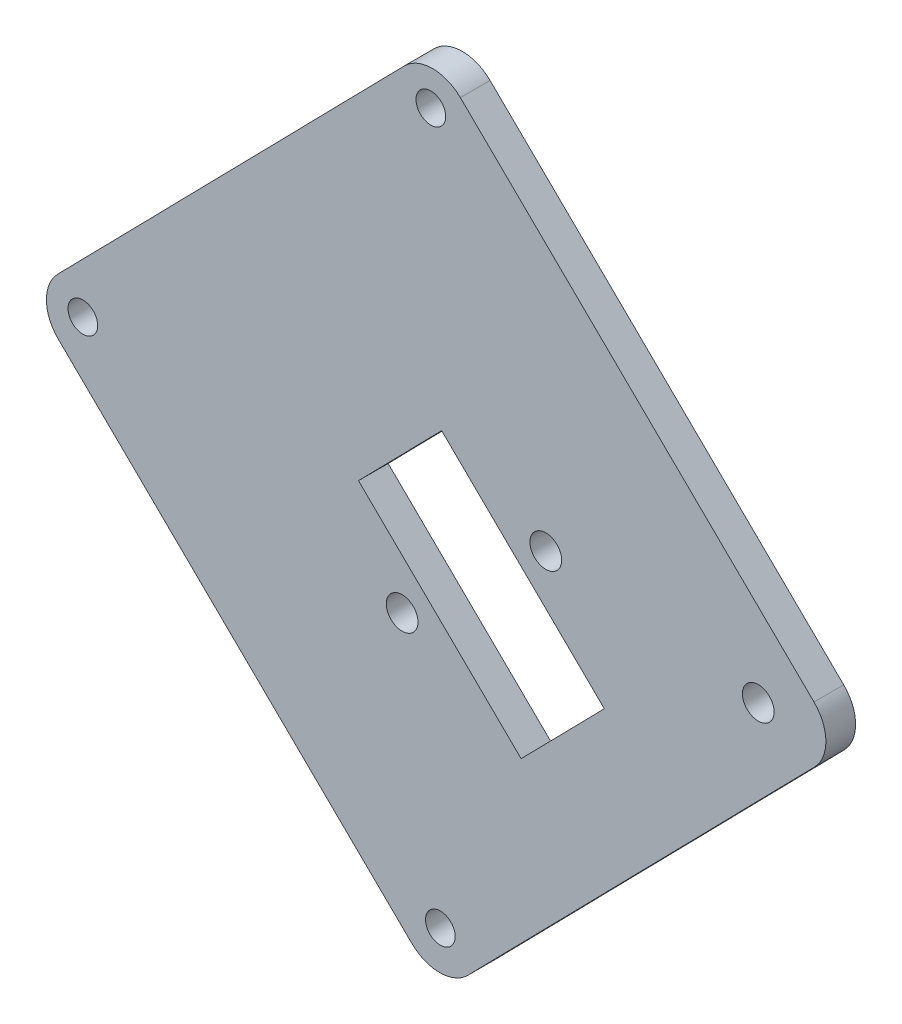
ISO-10303-21;
HEADER;
FILE_DESCRIPTION(('STEP AP214'),'2;1');
FILE_NAME('part.step','',(''),(''),'','','');
FILE_SCHEMA(('AUTOMOTIVE_DESIGN { 1 0 10303 214 1 1 1 1 }'));
ENDSEC;
DATA;
#1=APPLICATION_CONTEXT('core data for automotive mechanical design processes');
#2=APPLICATION_PROTOCOL_DEFINITION('international standard','automotive_design',2000,#1);
#3=PRODUCT_CONTEXT('',#1,'mechanical');
#4=PRODUCT('Part','Part','',(#3));
#5=PRODUCT_RELATED_PRODUCT_CATEGORY('part','',(#4));
#6=PRODUCT_DEFINITION_FORMATION('','',#4);
#7=PRODUCT_DEFINITION_CONTEXT('part definition',#1,'design');
#8=PRODUCT_DEFINITION('design','',#6,#7);
#9=PRODUCT_DEFINITION_SHAPE('','',#8);
#10=(LENGTH_UNIT() NAMED_UNIT(*) SI_UNIT(.MILLI.,.METRE.));
#11=(NAMED_UNIT(*) PLANE_ANGLE_UNIT() SI_UNIT($,.RADIAN.));
#12=(NAMED_UNIT(*) SI_UNIT($,.STERADIAN.) SOLID_ANGLE_UNIT());
#13=UNCERTAINTY_MEASURE_WITH_UNIT(LENGTH_MEASURE(1.E-05),#10,'distance_accuracy_value','');
#14=(GEOMETRIC_REPRESENTATION_CONTEXT(3) GLOBAL_UNCERTAINTY_ASSIGNED_CONTEXT((#13)) GLOBAL_UNIT_ASSIGNED_CONTEXT((#10,
#11,#12)) REPRESENTATION_CONTEXT('',''));
#15=CARTESIAN_POINT('',(0.,0.,0.));
#16=DIRECTION('',(0.,0.,1.));
#17=DIRECTION('',(1.,0.,0.));
#18=AXIS2_PLACEMENT_3D('',#15,#16,#17);
#19=CARTESIAN_POINT('',(35.0687942820861,0.615483898388567,3.));
#20=DIRECTION('',(0.,0.,-1.));
#21=DIRECTION('',(-1.,0.,0.));
#22=AXIS2_PLACEMENT_3D('',#19,#20,#21);
#23=PLANE('',#22);
#24=CARTESIAN_POINT('',(-0.820879587953391,36.0721307997572,3.));
#25=DIRECTION('',(0.,0.,-1.));
#26=DIRECTION('',(-1.,0.,0.));
#27=AXIS2_PLACEMENT_3D('',#24,#25,#26);
#28=CIRCLE('',#27,1.5);
#29=CARTESIAN_POINT('',(-2.32087958795339,36.0721307997572,3.));
#30=VERTEX_POINT('',#29);
#31=EDGE_CURVE('E364',#30,#30,#28,.T.);
#32=ORIENTED_EDGE('',*,*,#31,.T.);
#33=EDGE_LOOP('',(#32));
#34=FACE_BOUND('',#33,.T.);
#35=CARTESIAN_POINT('',(-35.959699189732,0.221003104890149,3.));
#36=DIRECTION('',(0.,0.,-1.));
#37=DIRECTION('',(-1.,0.,0.));
#38=AXIS2_PLACEMENT_3D('',#35,#36,#37);
#39=CIRCLE('',#38,1.5);
#40=CARTESIAN_POINT('',(-37.459699189732,0.221003104890149,3.));
#41=VERTEX_POINT('',#40);
#42=EDGE_CURVE('E367',#41,#41,#39,.T.);
#43=ORIENTED_EDGE('',*,*,#42,.T.);
#44=EDGE_LOOP('',(#43));
#45=FACE_BOUND('',#44,.T.);
#46=CARTESIAN_POINT('',(0.141386566752624,-35.1628082670204,3.));
#47=DIRECTION('',(0.,0.,-1.));
#48=DIRECTION('',(-1.,0.,0.));
#49=AXIS2_PLACEMENT_3D('',#46,#47,#48);
#50=CIRCLE('',#49,1.5);
#51=CARTESIAN_POINT('',(-1.35861343324738,-35.1628082670204,3.));
#52=VERTEX_POINT('',#51);
#53=EDGE_CURVE('E376',#52,#52,#50,.T.);
#54=ORIENTED_EDGE('',*,*,#53,.T.);
#55=EDGE_LOOP('',(#54));
#56=FACE_BOUND('',#55,.T.);
#57=CARTESIAN_POINT('',(35.0687942820861,0.615483898388567,3.));
#58=DIRECTION('',(0.,0.,1.));
#59=DIRECTION('',(-1.,0.,0.));
#60=AXIS2_PLACEMENT_3D('',#57,#58,#59);
#61=CIRCLE('',#60,4.);
#62=CARTESIAN_POINT('',(37.9254578434301,-2.18442204597626,3.));
#63=VERTEX_POINT('',#62);
#64=CARTESIAN_POINT('',(37.868700226451,3.47214745973255,3.));
#65=VERTEX_POINT('',#64);
#66=EDGE_CURVE('E180',#63,#65,#61,.T.);
#67=ORIENTED_EDGE('',*,*,#66,.T.);
#68=DIRECTION('',(-0.714165890335996,0.699976486091207,0.));
#69=VECTOR('',#68,1.);
#70=CARTESIAN_POINT('',(2.16040570984637,38.4709717641016,3.));
#71=LINE('',#70,#69);
#72=CARTESIAN_POINT('',(2.16040570984637,38.4709717641016,3.));
#73=VERTEX_POINT('',#72);
#74=EDGE_CURVE('E184',#65,#73,#71,.T.);
#75=ORIENTED_EDGE('',*,*,#74,.T.);
#76=CARTESIAN_POINT('',(-0.639500234518456,35.6143082027576,3.));
#77=DIRECTION('',(0.,0.,1.));
#78=DIRECTION('',(1.,0.,0.));
#79=AXIS2_PLACEMENT_3D('',#76,#77,#78);
#80=CIRCLE('',#79,4.);
#81=CARTESIAN_POINT('',(-3.49616379586244,38.4142141471224,3.));
#82=VERTEX_POINT('',#81);
#83=EDGE_CURVE('E188',#73,#82,#80,.T.);
#84=ORIENTED_EDGE('',*,*,#83,.T.);
#85=DIRECTION('',(-0.699976486091208,-0.714165890335996,0.));
#86=VECTOR('',#85,1.);
#87=CARTESIAN_POINT('',(-3.49616379586244,38.4142141471224,3.));
#88=LINE('',#87,#86);
#89=CARTESIAN_POINT('',(-38.4949881002315,2.70591963051785,3.));
#90=VERTEX_POINT('',#89);
#91=EDGE_CURVE('E191',#82,#90,#88,.T.);
#92=ORIENTED_EDGE('',*,*,#91,.T.);
#93=CARTESIAN_POINT('',(-35.6383245388875,-0.0939863138469728,3.));
#94=DIRECTION('',(0.,0.,1.));
#95=DIRECTION('',(-1.,0.,0.));
#96=AXIS2_PLACEMENT_3D('',#93,#94,#95);
#97=CIRCLE('',#96,3.99999999999999);
#98=CARTESIAN_POINT('',(-38.4382304832523,-2.95064987519095,3.));
#99=VERTEX_POINT('',#98);
#100=EDGE_CURVE('E194',#90,#99,#97,.T.);
#101=ORIENTED_EDGE('',*,*,#100,.T.);
#102=DIRECTION('',(0.714165890335996,-0.699976486091207,0.));
#103=VECTOR('',#102,1.);
#104=CARTESIAN_POINT('',(-38.4382304832523,-2.95064987519095,3.));
#105=LINE('',#104,#103);
#106=CARTESIAN_POINT('',(-2.72993596664772,-37.94947417956,3.));
#107=VERTEX_POINT('',#106);
#108=EDGE_CURVE('E197',#99,#107,#105,.T.);
#109=ORIENTED_EDGE('',*,*,#108,.T.);
#110=CARTESIAN_POINT('',(0.0699699777171048,-35.092810618216,3.));
#111=DIRECTION('',(0.,0.,1.));
#112=DIRECTION('',(1.,0.,0.));
#113=AXIS2_PLACEMENT_3D('',#110,#111,#112);
#114=CIRCLE('',#113,4.);
#115=CARTESIAN_POINT('',(2.92663353906109,-37.8927165625808,3.));
#116=VERTEX_POINT('',#115);
#117=EDGE_CURVE('E200',#107,#116,#114,.T.);
#118=ORIENTED_EDGE('',*,*,#117,.T.);
#119=DIRECTION('',(0.699976486091207,0.714165890335996,0.));
#120=VECTOR('',#119,1.);
#121=CARTESIAN_POINT('',(2.92663353906109,-37.8927165625808,3.));
#122=LINE('',#121,#120);
#123=EDGE_CURVE('E203',#116,#63,#122,.T.);
#124=ORIENTED_EDGE('',*,*,#123,.T.);
#125=EDGE_LOOP('',(#67,#75,#84,#92,#101,#109,#118,#124));
#126=FACE_BOUND('',#125,.T.);
#127=DIRECTION('',(-0.699976486091207,-0.714165890335996,0.));
#128=VECTOR('',#127,1.);
#129=CARTESIAN_POINT('',(0.271574381812696,8.40004891855794,3.));
#130=LINE('',#129,#128);
#131=CARTESIAN_POINT('',(0.271574381812696,8.40004891855794,3.));
#132=VERTEX_POINT('',#131);
#133=CARTESIAN_POINT('',(-8.1281434512818,-0.169941765474024,3.));
#134=VERTEX_POINT('',#133);
#135=EDGE_CURVE('E128',#132,#134,#130,.T.);
#136=ORIENTED_EDGE('',*,*,#135,.F.);
#137=DIRECTION('',(-0.714165890335996,0.699976486091207,0.));
#138=VECTOR('',#137,1.);
#139=CARTESIAN_POINT('',(16.6973898595406,-7.69941026153983,3.));
#140=LINE('',#139,#138);
#141=CARTESIAN_POINT('',(16.6973898595406,-7.69941026153983,3.));
#142=VERTEX_POINT('',#141);
#143=EDGE_CURVE('E156',#142,#132,#140,.T.);
#144=ORIENTED_EDGE('',*,*,#143,.F.);
#145=DIRECTION('',(0.699976486091207,0.714165890335996,0.));
#146=VECTOR('',#145,1.);
#147=CARTESIAN_POINT('',(16.6973898595406,-7.69941026153983,3.));
#148=LINE('',#147,#146);
#149=CARTESIAN_POINT('',(8.2976720264461,-16.2694009455718,3.));
#150=VERTEX_POINT('',#149);
#151=EDGE_CURVE('E151',#150,#142,#148,.T.);
#152=ORIENTED_EDGE('',*,*,#151,.F.);
#153=DIRECTION('',(0.714165890335996,-0.699976486091207,0.));
#154=VECTOR('',#153,1.);
#155=CARTESIAN_POINT('',(8.2976720264461,-16.2694009455718,3.));
#156=LINE('',#155,#154);
#157=EDGE_CURVE('E137',#134,#150,#156,.T.);
#158=ORIENTED_EDGE('',*,*,#157,.F.);
#159=EDGE_LOOP('',(#136,#144,#152,#158));
#160=FACE_BOUND('',#159,.T.);
#161=CARTESIAN_POINT('',(32.240509529425,0.587105089898975,3.));
#162=DIRECTION('',(0.,0.,1.));
#163=DIRECTION('',(1.,0.,0.));
#164=AXIS2_PLACEMENT_3D('',#161,#162,#163);
#165=CIRCLE('',#164,1.60000000000003);
#166=CARTESIAN_POINT('',(33.840509529425,0.587105089898975,3.));
#167=VERTEX_POINT('',#166);
#168=EDGE_CURVE('E164',#167,#167,#165,.T.);
#169=ORIENTED_EDGE('',*,*,#168,.F.);
#170=EDGE_LOOP('',(#169));
#171=FACE_BOUND('',#170,.T.);
#172=CARTESIAN_POINT('',(10.7901477035039,3.13130947954543,3.));
#173=DIRECTION('',(0.,0.,1.));
#174=DIRECTION('',(1.,0.,0.));
#175=AXIS2_PLACEMENT_3D('',#172,#173,#174);
#176=CIRCLE('',#175,1.60000000000001);
#177=CARTESIAN_POINT('',(12.3901477035039,3.13130947954543,3.));
#178=VERTEX_POINT('',#177);
#179=EDGE_CURVE('E384',#178,#178,#176,.T.);
#180=ORIENTED_EDGE('',*,*,#179,.F.);
#181=EDGE_LOOP('',(#180));
#182=FACE_BOUND('',#181,.T.);
#183=CARTESIAN_POINT('',(-3.72064966495195,-9.5307108857681,3.));
#184=DIRECTION('',(0.,0.,1.));
#185=DIRECTION('',(1.,0.,0.));
#186=AXIS2_PLACEMENT_3D('',#183,#184,#185);
#187=CIRCLE('',#186,1.60000000000001);
#188=CARTESIAN_POINT('',(-2.12064966495195,-9.5307108857681,3.));
#189=VERTEX_POINT('',#188);
#190=EDGE_CURVE('E373',#189,#189,#187,.T.);
#191=ORIENTED_EDGE('',*,*,#190,.F.);
#192=EDGE_LOOP('',(#191));
#193=FACE_BOUND('',#192,.T.);
#194=ADVANCED_FACE('F38',(#34,#45,#56,#126,#160,#171,#182,#193),#23,.F.);
#195=CARTESIAN_POINT('',(35.0687942820861,0.615483898388567,0.));
#196=DIRECTION('',(0.,0.,-1.));
#197=DIRECTION('',(-1.,0.,0.));
#198=AXIS2_PLACEMENT_3D('',#195,#196,#197);
#199=PLANE('',#198);
#200=CARTESIAN_POINT('',(-0.820879587953391,36.0721307997572,0.));
#201=DIRECTION('',(0.,0.,-1.));
#202=DIRECTION('',(-1.,0.,0.));
#203=AXIS2_PLACEMENT_3D('',#200,#201,#202);
#204=CIRCLE('',#203,1.5);
#205=CARTESIAN_POINT('',(-2.32087958795339,36.0721307997572,0.));
#206=VERTEX_POINT('',#205);
#207=EDGE_CURVE('E362',#206,#206,#204,.T.);
#208=ORIENTED_EDGE('',*,*,#207,.F.);
#209=EDGE_LOOP('',(#208));
#210=FACE_BOUND('',#209,.T.);
#211=CARTESIAN_POINT('',(-35.959699189732,0.221003104890149,0.));
#212=DIRECTION('',(0.,0.,-1.));
#213=DIRECTION('',(-1.,0.,0.));
#214=AXIS2_PLACEMENT_3D('',#211,#212,#213);
#215=CIRCLE('',#214,1.5);
#216=CARTESIAN_POINT('',(-37.459699189732,0.221003104890149,0.));
#217=VERTEX_POINT('',#216);
#218=EDGE_CURVE('E429',#217,#217,#215,.T.);
#219=ORIENTED_EDGE('',*,*,#218,.F.);
#220=EDGE_LOOP('',(#219));
#221=FACE_BOUND('',#220,.T.);
#222=CARTESIAN_POINT('',(0.141386566752624,-35.1628082670204,0.));
#223=DIRECTION('',(0.,0.,-1.));
#224=DIRECTION('',(-1.,0.,0.));
#225=AXIS2_PLACEMENT_3D('',#222,#223,#224);
#226=CIRCLE('',#225,1.5);
#227=CARTESIAN_POINT('',(-1.35861343324738,-35.1628082670204,0.));
#228=VERTEX_POINT('',#227);
#229=EDGE_CURVE('E425',#228,#228,#226,.T.);
#230=ORIENTED_EDGE('',*,*,#229,.F.);
#231=EDGE_LOOP('',(#230));
#232=FACE_BOUND('',#231,.T.);
#233=CARTESIAN_POINT('',(10.7901477035039,3.13130947954543,0.));
#234=DIRECTION('',(0.,0.,1.));
#235=DIRECTION('',(1.,0.,0.));
#236=AXIS2_PLACEMENT_3D('',#233,#234,#235);
#237=CIRCLE('',#236,1.60000000000001);
#238=CARTESIAN_POINT('',(12.3901477035039,3.13130947954543,0.));
#239=VERTEX_POINT('',#238);
#240=EDGE_CURVE('E382',#239,#239,#237,.T.);
#241=ORIENTED_EDGE('',*,*,#240,.T.);
#242=EDGE_LOOP('',(#241));
#243=FACE_BOUND('',#242,.T.);
#244=DIRECTION('',(-0.714165890335996,0.699976486091207,0.));
#245=VECTOR('',#244,1.);
#246=CARTESIAN_POINT('',(16.6973898595406,-7.69941026153983,0.));
#247=LINE('',#246,#245);
#248=CARTESIAN_POINT('',(16.6973898595406,-7.69941026153983,0.));
#249=VERTEX_POINT('',#248);
#250=CARTESIAN_POINT('',(0.271574381812696,8.40004891855794,0.));
#251=VERTEX_POINT('',#250);
#252=EDGE_CURVE('E138',#249,#251,#247,.T.);
#253=ORIENTED_EDGE('',*,*,#252,.T.);
#254=DIRECTION('',(-0.699976486091207,-0.714165890335996,0.));
#255=VECTOR('',#254,1.);
#256=CARTESIAN_POINT('',(0.271574381812696,8.40004891855794,0.));
#257=LINE('',#256,#255);
#258=CARTESIAN_POINT('',(-8.1281434512818,-0.169941765474024,0.));
#259=VERTEX_POINT('',#258);
#260=EDGE_CURVE('E62',#251,#259,#257,.T.);
#261=ORIENTED_EDGE('',*,*,#260,.T.);
#262=DIRECTION('',(0.714165890335996,-0.699976486091207,0.));
#263=VECTOR('',#262,1.);
#264=CARTESIAN_POINT('',(8.2976720264461,-16.2694009455718,0.));
#265=LINE('',#264,#263);
#266=CARTESIAN_POINT('',(8.2976720264461,-16.2694009455718,0.));
#267=VERTEX_POINT('',#266);
#268=EDGE_CURVE('E144',#259,#267,#265,.T.);
#269=ORIENTED_EDGE('',*,*,#268,.T.);
#270=DIRECTION('',(0.699976486091207,0.714165890335996,0.));
#271=VECTOR('',#270,1.);
#272=CARTESIAN_POINT('',(16.6973898595406,-7.69941026153983,0.));
#273=LINE('',#272,#271);
#274=EDGE_CURVE('E167',#267,#249,#273,.T.);
#275=ORIENTED_EDGE('',*,*,#274,.T.);
#276=EDGE_LOOP('',(#253,#261,#269,#275));
#277=FACE_BOUND('',#276,.T.);
#278=CARTESIAN_POINT('',(35.0687942820861,0.615483898388567,0.));
#279=DIRECTION('',(0.,0.,1.));
#280=DIRECTION('',(-1.,0.,0.));
#281=AXIS2_PLACEMENT_3D('',#278,#279,#280);
#282=CIRCLE('',#281,4.);
#283=CARTESIAN_POINT('',(37.9254578434301,-2.18442204597626,0.));
#284=VERTEX_POINT('',#283);
#285=CARTESIAN_POINT('',(37.868700226451,3.47214745973255,0.));
#286=VERTEX_POINT('',#285);
#287=EDGE_CURVE('E146',#284,#286,#282,.T.);
#288=ORIENTED_EDGE('',*,*,#287,.F.);
#289=DIRECTION('',(0.699976486091207,0.714165890335996,0.));
#290=VECTOR('',#289,1.);
#291=CARTESIAN_POINT('',(2.92663353906109,-37.8927165625808,0.));
#292=LINE('',#291,#290);
#293=CARTESIAN_POINT('',(2.92663353906109,-37.8927165625808,0.));
#294=VERTEX_POINT('',#293);
#295=EDGE_CURVE('E185',#294,#284,#292,.T.);
#296=ORIENTED_EDGE('',*,*,#295,.F.);
#297=CARTESIAN_POINT('',(0.0699699777171048,-35.092810618216,0.));
#298=DIRECTION('',(0.,0.,1.));
#299=DIRECTION('',(1.,0.,0.));
#300=AXIS2_PLACEMENT_3D('',#297,#298,#299);
#301=CIRCLE('',#300,4.);
#302=CARTESIAN_POINT('',(-2.72993596664772,-37.94947417956,0.));
#303=VERTEX_POINT('',#302);
#304=EDGE_CURVE('E225',#303,#294,#301,.T.);
#305=ORIENTED_EDGE('',*,*,#304,.F.);
#306=DIRECTION('',(0.714165890335996,-0.699976486091207,0.));
#307=VECTOR('',#306,1.);
#308=CARTESIAN_POINT('',(-38.4382304832523,-2.95064987519095,0.));
#309=LINE('',#308,#307);
#310=CARTESIAN_POINT('',(-38.4382304832523,-2.95064987519095,0.));
#311=VERTEX_POINT('',#310);
#312=EDGE_CURVE('E222',#311,#303,#309,.T.);
#313=ORIENTED_EDGE('',*,*,#312,.F.);
#314=CARTESIAN_POINT('',(-35.6383245388875,-0.0939863138469728,0.));
#315=DIRECTION('',(0.,0.,1.));
#316=DIRECTION('',(-1.,0.,0.));
#317=AXIS2_PLACEMENT_3D('',#314,#315,#316);
#318=CIRCLE('',#317,3.99999999999999);
#319=CARTESIAN_POINT('',(-38.4949881002315,2.70591963051785,0.));
#320=VERTEX_POINT('',#319);
#321=EDGE_CURVE('E219',#320,#311,#318,.T.);
#322=ORIENTED_EDGE('',*,*,#321,.F.);
#323=DIRECTION('',(-0.699976486091208,-0.714165890335996,0.));
#324=VECTOR('',#323,1.);
#325=CARTESIAN_POINT('',(-3.49616379586244,38.4142141471224,0.));
#326=LINE('',#325,#324);
#327=CARTESIAN_POINT('',(-3.49616379586244,38.4142141471224,0.));
#328=VERTEX_POINT('',#327);
#329=EDGE_CURVE('E216',#328,#320,#326,.T.);
#330=ORIENTED_EDGE('',*,*,#329,.F.);
#331=CARTESIAN_POINT('',(-0.639500234518456,35.6143082027576,0.));
#332=DIRECTION('',(0.,0.,1.));
#333=DIRECTION('',(1.,0.,0.));
#334=AXIS2_PLACEMENT_3D('',#331,#332,#333);
#335=CIRCLE('',#334,4.);
#336=CARTESIAN_POINT('',(2.16040570984637,38.4709717641016,0.));
#337=VERTEX_POINT('',#336);
#338=EDGE_CURVE('E213',#337,#328,#335,.T.);
#339=ORIENTED_EDGE('',*,*,#338,.F.);
#340=DIRECTION('',(-0.714165890335996,0.699976486091207,0.));
#341=VECTOR('',#340,1.);
#342=CARTESIAN_POINT('',(2.16040570984637,38.4709717641016,0.));
#343=LINE('',#342,#341);
#344=EDGE_CURVE('E210',#286,#337,#343,.T.);
#345=ORIENTED_EDGE('',*,*,#344,.F.);
#346=EDGE_LOOP('',(#288,#296,#305,#313,#322,#330,#339,#345));
#347=FACE_BOUND('',#346,.T.);
#348=CARTESIAN_POINT('',(32.240509529425,0.587105089898975,0.));
#349=DIRECTION('',(0.,0.,1.));
#350=DIRECTION('',(1.,0.,0.));
#351=AXIS2_PLACEMENT_3D('',#348,#349,#350);
#352=CIRCLE('',#351,1.60000000000003);
#353=CARTESIAN_POINT('',(33.840509529425,0.587105089898975,0.));
#354=VERTEX_POINT('',#353);
#355=EDGE_CURVE('E388',#354,#354,#352,.T.);
#356=ORIENTED_EDGE('',*,*,#355,.T.);
#357=EDGE_LOOP('',(#356));
#358=FACE_BOUND('',#357,.T.);
#359=CARTESIAN_POINT('',(-3.72064966495195,-9.5307108857681,0.));
#360=DIRECTION('',(0.,0.,1.));
#361=DIRECTION('',(1.,0.,0.));
#362=AXIS2_PLACEMENT_3D('',#359,#360,#361);
#363=CIRCLE('',#362,1.60000000000001);
#364=CARTESIAN_POINT('',(-2.12064966495195,-9.5307108857681,0.));
#365=VERTEX_POINT('',#364);
#366=EDGE_CURVE('E366',#365,#365,#363,.T.);
#367=ORIENTED_EDGE('',*,*,#366,.T.);
#368=EDGE_LOOP('',(#367));
#369=FACE_BOUND('',#368,.T.);
#370=ADVANCED_FACE('F265',(#210,#221,#232,#243,#277,#347,#358,#369),#199,.T.);
#371=CARTESIAN_POINT('',(35.0687942820861,0.615483898388567,3.));
#372=DIRECTION('',(0.,0.,-1.));
#373=DIRECTION('',(-1.,0.,0.));
#374=AXIS2_PLACEMENT_3D('',#371,#372,#373);
#375=CYLINDRICAL_SURFACE('',#374,4.);
#376=ORIENTED_EDGE('',*,*,#287,.T.);
#377=DIRECTION('',(0.,0.,-1.));
#378=VECTOR('',#377,1.);
#379=CARTESIAN_POINT('',(37.868700226451,3.47214745973255,3.));
#380=LINE('',#379,#378);
#381=EDGE_CURVE('E11',#65,#286,#380,.T.);
#382=ORIENTED_EDGE('',*,*,#381,.F.);
#383=ORIENTED_EDGE('',*,*,#66,.F.);
#384=DIRECTION('',(0.,0.,-1.));
#385=VECTOR('',#384,1.);
#386=CARTESIAN_POINT('',(37.9254578434301,-2.18442204597626,3.));
#387=LINE('',#386,#385);
#388=EDGE_CURVE('E206',#63,#284,#387,.T.);
#389=ORIENTED_EDGE('',*,*,#388,.T.);
#390=EDGE_LOOP('',(#376,#382,#383,#389));
#391=FACE_BOUND('',#390,.T.);
#392=ADVANCED_FACE('F40',(#391),#375,.T.);
#393=CARTESIAN_POINT('',(2.16040570984637,38.4709717641016,3.));
#394=DIRECTION('',(-0.699976486091207,-0.714165890335996,0.));
#395=DIRECTION('',(0.714165890335996,-0.699976486091207,0.));
#396=AXIS2_PLACEMENT_3D('',#393,#394,#395);
#397=PLANE('',#396);
#398=ORIENTED_EDGE('',*,*,#344,.T.);
#399=DIRECTION('',(0.,0.,-1.));
#400=VECTOR('',#399,1.);
#401=CARTESIAN_POINT('',(2.16040570984637,38.4709717641016,3.));
#402=LINE('',#401,#400);
#403=EDGE_CURVE('E47',#73,#337,#402,.T.);
#404=ORIENTED_EDGE('',*,*,#403,.F.);
#405=ORIENTED_EDGE('',*,*,#74,.F.);
#406=ORIENTED_EDGE('',*,*,#381,.T.);
#407=EDGE_LOOP('',(#398,#404,#405,#406));
#408=FACE_BOUND('',#407,.T.);
#409=ADVANCED_FACE('F282',(#408),#397,.F.);
#410=CARTESIAN_POINT('',(-0.639500234518456,35.6143082027576,3.));
#411=DIRECTION('',(0.,0.,-1.));
#412=DIRECTION('',(-1.,0.,0.));
#413=AXIS2_PLACEMENT_3D('',#410,#411,#412);
#414=CYLINDRICAL_SURFACE('',#413,4.);
#415=ORIENTED_EDGE('',*,*,#338,.T.);
#416=DIRECTION('',(0.,0.,-1.));
#417=VECTOR('',#416,1.);
#418=CARTESIAN_POINT('',(-3.49616379586244,38.4142141471224,3.));
#419=LINE('',#418,#417);
#420=EDGE_CURVE('E249',#82,#328,#419,.T.);
#421=ORIENTED_EDGE('',*,*,#420,.F.);
#422=ORIENTED_EDGE('',*,*,#83,.F.);
#423=ORIENTED_EDGE('',*,*,#403,.T.);
#424=EDGE_LOOP('',(#415,#421,#422,#423));
#425=FACE_BOUND('',#424,.T.);
#426=ADVANCED_FACE('F259',(#425),#414,.T.);
#427=CARTESIAN_POINT('',(-3.49616379586244,38.4142141471224,3.));
#428=DIRECTION('',(0.714165890335996,-0.699976486091208,0.));
#429=DIRECTION('',(0.699976486091208,0.714165890335996,0.));
#430=AXIS2_PLACEMENT_3D('',#427,#428,#429);
#431=PLANE('',#430);
#432=ORIENTED_EDGE('',*,*,#329,.T.);
#433=DIRECTION('',(0.,0.,-1.));
#434=VECTOR('',#433,1.);
#435=CARTESIAN_POINT('',(-38.4949881002315,2.70591963051785,3.));
#436=LINE('',#435,#434);
#437=EDGE_CURVE('E245',#90,#320,#436,.T.);
#438=ORIENTED_EDGE('',*,*,#437,.F.);
#439=ORIENTED_EDGE('',*,*,#91,.F.);
#440=ORIENTED_EDGE('',*,*,#420,.T.);
#441=EDGE_LOOP('',(#432,#438,#439,#440));
#442=FACE_BOUND('',#441,.T.);
#443=ADVANCED_FACE('F271',(#442),#431,.F.);
#444=CARTESIAN_POINT('',(-35.6383245388875,-0.0939863138469728,3.));
#445=DIRECTION('',(0.,0.,-1.));
#446=DIRECTION('',(-1.,0.,0.));
#447=AXIS2_PLACEMENT_3D('',#444,#445,#446);
#448=CYLINDRICAL_SURFACE('',#447,3.99999999999999);
#449=ORIENTED_EDGE('',*,*,#321,.T.);
#450=DIRECTION('',(0.,0.,-1.));
#451=VECTOR('',#450,1.);
#452=CARTESIAN_POINT('',(-38.4382304832523,-2.95064987519095,3.));
#453=LINE('',#452,#451);
#454=EDGE_CURVE('E241',#99,#311,#453,.T.);
#455=ORIENTED_EDGE('',*,*,#454,.F.);
#456=ORIENTED_EDGE('',*,*,#100,.F.);
#457=ORIENTED_EDGE('',*,*,#437,.T.);
#458=EDGE_LOOP('',(#449,#455,#456,#457));
#459=FACE_BOUND('',#458,.T.);
#460=ADVANCED_FACE('F275',(#459),#448,.T.);
#461=CARTESIAN_POINT('',(-38.4382304832523,-2.95064987519095,3.));
#462=DIRECTION('',(0.699976486091207,0.714165890335996,0.));
#463=DIRECTION('',(-0.714165890335996,0.699976486091207,0.));
#464=AXIS2_PLACEMENT_3D('',#461,#462,#463);
#465=PLANE('',#464);
#466=ORIENTED_EDGE('',*,*,#312,.T.);
#467=DIRECTION('',(0.,0.,-1.));
#468=VECTOR('',#467,1.);
#469=CARTESIAN_POINT('',(-2.72993596664772,-37.94947417956,3.));
#470=LINE('',#469,#468);
#471=EDGE_CURVE('E237',#107,#303,#470,.T.);
#472=ORIENTED_EDGE('',*,*,#471,.F.);
#473=ORIENTED_EDGE('',*,*,#108,.F.);
#474=ORIENTED_EDGE('',*,*,#454,.T.);
#475=EDGE_LOOP('',(#466,#472,#473,#474));
#476=FACE_BOUND('',#475,.T.);
#477=ADVANCED_FACE('F295',(#476),#465,.F.);
#478=CARTESIAN_POINT('',(0.0699699777171048,-35.092810618216,3.));
#479=DIRECTION('',(0.,0.,-1.));
#480=DIRECTION('',(-1.,0.,0.));
#481=AXIS2_PLACEMENT_3D('',#478,#479,#480);
#482=CYLINDRICAL_SURFACE('',#481,4.);
#483=ORIENTED_EDGE('',*,*,#304,.T.);
#484=DIRECTION('',(0.,0.,-1.));
#485=VECTOR('',#484,1.);
#486=CARTESIAN_POINT('',(2.92663353906109,-37.8927165625808,3.));
#487=LINE('',#486,#485);
#488=EDGE_CURVE('E233',#116,#294,#487,.T.);
#489=ORIENTED_EDGE('',*,*,#488,.F.);
#490=ORIENTED_EDGE('',*,*,#117,.F.);
#491=ORIENTED_EDGE('',*,*,#471,.T.);
#492=EDGE_LOOP('',(#483,#489,#490,#491));
#493=FACE_BOUND('',#492,.T.);
#494=ADVANCED_FACE('F293',(#493),#482,.T.);
#495=CARTESIAN_POINT('',(2.92663353906109,-37.8927165625808,3.));
#496=DIRECTION('',(-0.714165890335996,0.699976486091207,0.));
#497=DIRECTION('',(-0.699976486091207,-0.714165890335996,0.));
#498=AXIS2_PLACEMENT_3D('',#495,#496,#497);
#499=PLANE('',#498);
#500=ORIENTED_EDGE('',*,*,#295,.T.);
#501=ORIENTED_EDGE('',*,*,#388,.F.);
#502=ORIENTED_EDGE('',*,*,#123,.F.);
#503=ORIENTED_EDGE('',*,*,#488,.T.);
#504=EDGE_LOOP('',(#500,#501,#502,#503));
#505=FACE_BOUND('',#504,.T.);
#506=ADVANCED_FACE('F288',(#505),#499,.F.);
#507=CARTESIAN_POINT('',(0.271574381812696,8.40004891855794,3.));
#508=DIRECTION('',(0.714165890335996,-0.699976486091207,0.));
#509=DIRECTION('',(0.699976486091207,0.714165890335996,0.));
#510=AXIS2_PLACEMENT_3D('',#507,#508,#509);
#511=PLANE('',#510);
#512=ORIENTED_EDGE('',*,*,#260,.F.);
#513=DIRECTION('',(0.,0.,-1.));
#514=VECTOR('',#513,1.);
#515=CARTESIAN_POINT('',(0.271574381812696,8.40004891855794,3.));
#516=LINE('',#515,#514);
#517=EDGE_CURVE('E132',#132,#251,#516,.T.);
#518=ORIENTED_EDGE('',*,*,#517,.F.);
#519=ORIENTED_EDGE('',*,*,#135,.T.);
#520=DIRECTION('',(0.,0.,-1.));
#521=VECTOR('',#520,1.);
#522=CARTESIAN_POINT('',(-8.1281434512818,-0.169941765474024,3.));
#523=LINE('',#522,#521);
#524=EDGE_CURVE('E131',#134,#259,#523,.T.);
#525=ORIENTED_EDGE('',*,*,#524,.T.);
#526=EDGE_LOOP('',(#512,#518,#519,#525));
#527=FACE_BOUND('',#526,.T.);
#528=ADVANCED_FACE('F130',(#527),#511,.T.);
#529=CARTESIAN_POINT('',(8.2976720264461,-16.2694009455718,3.));
#530=DIRECTION('',(0.699976486091208,0.714165890335996,0.));
#531=DIRECTION('',(-0.714165890335996,0.699976486091208,0.));
#532=AXIS2_PLACEMENT_3D('',#529,#530,#531);
#533=PLANE('',#532);
#534=ORIENTED_EDGE('',*,*,#268,.F.);
#535=ORIENTED_EDGE('',*,*,#524,.F.);
#536=ORIENTED_EDGE('',*,*,#157,.T.);
#537=DIRECTION('',(0.,0.,-1.));
#538=VECTOR('',#537,1.);
#539=CARTESIAN_POINT('',(8.2976720264461,-16.2694009455718,3.));
#540=LINE('',#539,#538);
#541=EDGE_CURVE('E147',#150,#267,#540,.T.);
#542=ORIENTED_EDGE('',*,*,#541,.T.);
#543=EDGE_LOOP('',(#534,#535,#536,#542));
#544=FACE_BOUND('',#543,.T.);
#545=ADVANCED_FACE('F141',(#544),#533,.T.);
#546=CARTESIAN_POINT('',(16.6973898595406,-7.69941026153983,3.));
#547=DIRECTION('',(-0.714165890335996,0.699976486091207,0.));
#548=DIRECTION('',(-0.699976486091207,-0.714165890335996,0.));
#549=AXIS2_PLACEMENT_3D('',#546,#547,#548);
#550=PLANE('',#549);
#551=ORIENTED_EDGE('',*,*,#274,.F.);
#552=ORIENTED_EDGE('',*,*,#541,.F.);
#553=ORIENTED_EDGE('',*,*,#151,.T.);
#554=DIRECTION('',(0.,0.,-1.));
#555=VECTOR('',#554,1.);
#556=CARTESIAN_POINT('',(16.6973898595406,-7.69941026153983,3.));
#557=LINE('',#556,#555);
#558=EDGE_CURVE('E54',#142,#249,#557,.T.);
#559=ORIENTED_EDGE('',*,*,#558,.T.);
#560=EDGE_LOOP('',(#551,#552,#553,#559));
#561=FACE_BOUND('',#560,.T.);
#562=ADVANCED_FACE('F324',(#561),#550,.T.);
#563=CARTESIAN_POINT('',(16.6973898595406,-7.69941026153983,3.));
#564=DIRECTION('',(-0.699976486091207,-0.714165890335996,0.));
#565=DIRECTION('',(0.714165890335996,-0.699976486091207,0.));
#566=AXIS2_PLACEMENT_3D('',#563,#564,#565);
#567=PLANE('',#566);
#568=ORIENTED_EDGE('',*,*,#252,.F.);
#569=ORIENTED_EDGE('',*,*,#558,.F.);
#570=ORIENTED_EDGE('',*,*,#143,.T.);
#571=ORIENTED_EDGE('',*,*,#517,.T.);
#572=EDGE_LOOP('',(#568,#569,#570,#571));
#573=FACE_BOUND('',#572,.T.);
#574=ADVANCED_FACE('F328',(#573),#567,.T.);
#575=CARTESIAN_POINT('',(32.240509529425,0.587105089898975,3.));
#576=DIRECTION('',(0.,0.,-1.));
#577=DIRECTION('',(-1.,0.,0.));
#578=AXIS2_PLACEMENT_3D('',#575,#576,#577);
#579=CYLINDRICAL_SURFACE('',#578,1.60000000000003);
#580=ORIENTED_EDGE('',*,*,#168,.T.);
#581=EDGE_LOOP('',(#580));
#582=FACE_BOUND('',#581,.T.);
#583=ORIENTED_EDGE('',*,*,#355,.F.);
#584=EDGE_LOOP('',(#583));
#585=FACE_BOUND('',#584,.T.);
#586=ADVANCED_FACE('F334',(#582,#585),#579,.F.);
#587=CARTESIAN_POINT('',(10.7901477035039,3.13130947954543,3.));
#588=DIRECTION('',(0.,0.,-1.));
#589=DIRECTION('',(-1.,0.,0.));
#590=AXIS2_PLACEMENT_3D('',#587,#588,#589);
#591=CYLINDRICAL_SURFACE('',#590,1.60000000000001);
#592=ORIENTED_EDGE('',*,*,#179,.T.);
#593=EDGE_LOOP('',(#592));
#594=FACE_BOUND('',#593,.T.);
#595=ORIENTED_EDGE('',*,*,#240,.F.);
#596=EDGE_LOOP('',(#595));
#597=FACE_BOUND('',#596,.T.);
#598=ADVANCED_FACE('F337',(#594,#597),#591,.F.);
#599=CARTESIAN_POINT('',(-3.72064966495195,-9.5307108857681,3.));
#600=DIRECTION('',(0.,0.,-1.));
#601=DIRECTION('',(-1.,0.,0.));
#602=AXIS2_PLACEMENT_3D('',#599,#600,#601);
#603=CYLINDRICAL_SURFACE('',#602,1.60000000000001);
#604=ORIENTED_EDGE('',*,*,#190,.T.);
#605=EDGE_LOOP('',(#604));
#606=FACE_BOUND('',#605,.T.);
#607=ORIENTED_EDGE('',*,*,#366,.F.);
#608=EDGE_LOOP('',(#607));
#609=FACE_BOUND('',#608,.T.);
#610=ADVANCED_FACE('F341',(#606,#609),#603,.F.);
#611=CARTESIAN_POINT('',(0.141386566752624,-35.1628082670204,10.));
#612=DIRECTION('',(0.,0.,-1.));
#613=DIRECTION('',(-1.,0.,0.));
#614=AXIS2_PLACEMENT_3D('',#611,#612,#613);
#615=CYLINDRICAL_SURFACE('',#614,1.5);
#616=ORIENTED_EDGE('',*,*,#229,.T.);
#617=EDGE_LOOP('',(#616));
#618=FACE_BOUND('',#617,.T.);
#619=ORIENTED_EDGE('',*,*,#53,.F.);
#620=EDGE_LOOP('',(#619));
#621=FACE_BOUND('',#620,.T.);
#622=ADVANCED_FACE('F345',(#618,#621),#615,.F.);
#623=CARTESIAN_POINT('',(-35.959699189732,0.221003104890149,10.));
#624=DIRECTION('',(0.,0.,-1.));
#625=DIRECTION('',(-1.,0.,0.));
#626=AXIS2_PLACEMENT_3D('',#623,#624,#625);
#627=CYLINDRICAL_SURFACE('',#626,1.5);
#628=ORIENTED_EDGE('',*,*,#218,.T.);
#629=EDGE_LOOP('',(#628));
#630=FACE_BOUND('',#629,.T.);
#631=ORIENTED_EDGE('',*,*,#42,.F.);
#632=EDGE_LOOP('',(#631));
#633=FACE_BOUND('',#632,.T.);
#634=ADVANCED_FACE('F349',(#630,#633),#627,.F.);
#635=CARTESIAN_POINT('',(-0.820879587953391,36.0721307997572,10.));
#636=DIRECTION('',(0.,0.,-1.));
#637=DIRECTION('',(-1.,0.,0.));
#638=AXIS2_PLACEMENT_3D('',#635,#636,#637);
#639=CYLINDRICAL_SURFACE('',#638,1.5);
#640=ORIENTED_EDGE('',*,*,#207,.T.);
#641=EDGE_LOOP('',(#640));
#642=FACE_BOUND('',#641,.T.);
#643=ORIENTED_EDGE('',*,*,#31,.F.);
#644=EDGE_LOOP('',(#643));
#645=FACE_BOUND('',#644,.T.);
#646=ADVANCED_FACE('F353',(#642,#645),#639,.F.);
#647=CLOSED_SHELL('',(#194,#370,#392,#409,#426,#443,#460,#477,#494,#506,#528,#545,#562,#574,
#586,#598,#610,#622,#634,#646));
#648=MANIFOLD_SOLID_BREP('B2',#647);
#649=ADVANCED_BREP_SHAPE_REPRESENTATION('',(#18,#648),#14);
#650=SHAPE_DEFINITION_REPRESENTATION(#9,#649);
ENDSEC;
END-ISO-10303-21;
